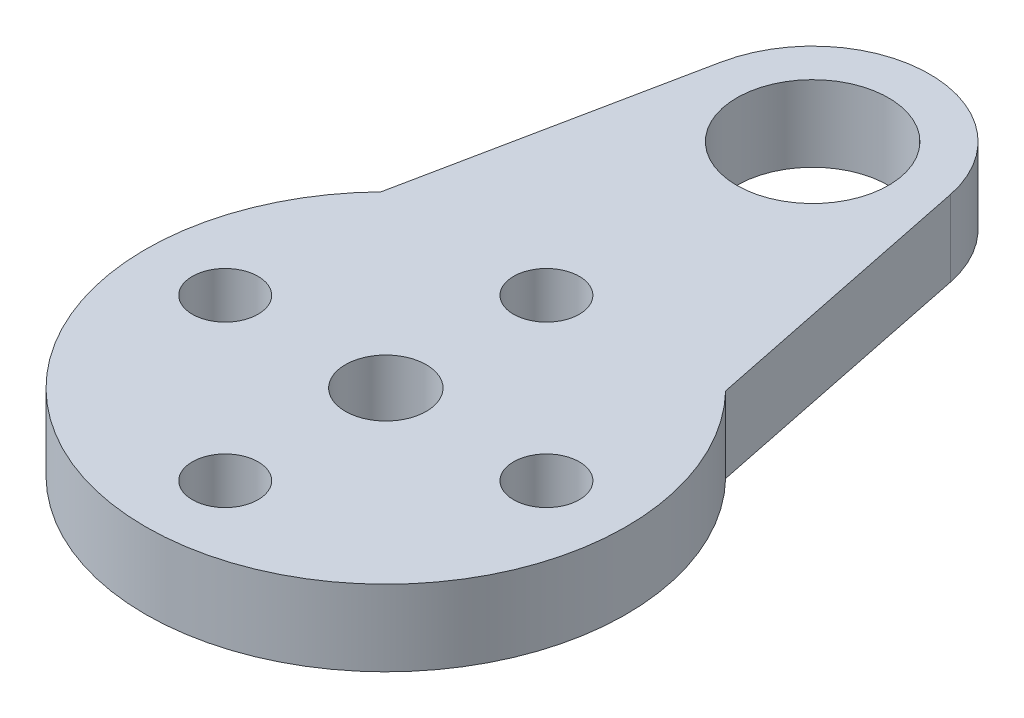
ISO-10303-21;
HEADER;
FILE_DESCRIPTION(('STEP AP214'),'2;1');
FILE_NAME('part.step','',(''),(''),'','','');
FILE_SCHEMA(('AUTOMOTIVE_DESIGN { 1 0 10303 214 1 1 1 1 }'));
ENDSEC;
DATA;
#1=APPLICATION_CONTEXT('core data for automotive mechanical design processes');
#2=APPLICATION_PROTOCOL_DEFINITION('international standard','automotive_design',2000,#1);
#3=PRODUCT_CONTEXT('',#1,'mechanical');
#4=PRODUCT('Part','Part','',(#3));
#5=PRODUCT_RELATED_PRODUCT_CATEGORY('part','',(#4));
#6=PRODUCT_DEFINITION_FORMATION('','',#4);
#7=PRODUCT_DEFINITION_CONTEXT('part definition',#1,'design');
#8=PRODUCT_DEFINITION('design','',#6,#7);
#9=PRODUCT_DEFINITION_SHAPE('','',#8);
#10=(LENGTH_UNIT() NAMED_UNIT(*) SI_UNIT(.MILLI.,.METRE.));
#11=(NAMED_UNIT(*) PLANE_ANGLE_UNIT() SI_UNIT($,.RADIAN.));
#12=(NAMED_UNIT(*) SI_UNIT($,.STERADIAN.) SOLID_ANGLE_UNIT());
#13=UNCERTAINTY_MEASURE_WITH_UNIT(LENGTH_MEASURE(1.E-05),#10,'distance_accuracy_value','');
#14=(GEOMETRIC_REPRESENTATION_CONTEXT(3) GLOBAL_UNCERTAINTY_ASSIGNED_CONTEXT((#13)) GLOBAL_UNIT_ASSIGNED_CONTEXT((#10,
#11,#12)) REPRESENTATION_CONTEXT('',''));
#15=CARTESIAN_POINT('',(0.,0.,0.));
#16=DIRECTION('',(0.,0.,1.));
#17=DIRECTION('',(1.,0.,0.));
#18=AXIS2_PLACEMENT_3D('',#15,#16,#17);
#19=CARTESIAN_POINT('',(0.,3.,-16.87456));
#20=DIRECTION('',(0.,1.,0.));
#21=DIRECTION('',(0.,0.,1.));
#22=AXIS2_PLACEMENT_3D('',#19,#20,#21);
#23=PLANE('',#22);
#24=DIRECTION('',(-0.2,0.,0.979795897113271));
#25=VECTOR('',#24,1.);
#26=CARTESIAN_POINT('',(-4.53164224618782,3.,-17.7995776));
#27=LINE('',#26,#25);
#28=CARTESIAN_POINT('',(-4.53164224618782,3.,-17.7995776));
#29=VERTEX_POINT('',#28);
#30=CARTESIAN_POINT('',(-6.81367210031021,3.,-6.61996015920445));
#31=VERTEX_POINT('',#30);
#32=EDGE_CURVE('E94',#29,#31,#27,.T.);
#33=ORIENTED_EDGE('',*,*,#32,.T.);
#34=CARTESIAN_POINT('',(0.,3.,0.));
#35=DIRECTION('',(0.,1.,0.));
#36=DIRECTION('',(0.,0.,1.));
#37=AXIS2_PLACEMENT_3D('',#34,#35,#36);
#38=CIRCLE('',#37,9.5);
#39=CARTESIAN_POINT('',(6.81367210031021,3.,-6.61996015920446));
#40=VERTEX_POINT('',#39);
#41=EDGE_CURVE('E48',#31,#40,#38,.T.);
#42=ORIENTED_EDGE('',*,*,#41,.T.);
#43=DIRECTION('',(-0.2,0.,-0.979795897113271));
#44=VECTOR('',#43,1.);
#45=CARTESIAN_POINT('',(4.53164224618782,3.,-17.7995776));
#46=LINE('',#45,#44);
#47=CARTESIAN_POINT('',(4.53164224618782,3.,-17.7995776));
#48=VERTEX_POINT('',#47);
#49=EDGE_CURVE('E54',#40,#48,#46,.T.);
#50=ORIENTED_EDGE('',*,*,#49,.T.);
#51=CARTESIAN_POINT('',(0.,3.,-16.87456));
#52=DIRECTION('',(0.,1.,0.));
#53=DIRECTION('',(0.,0.,1.));
#54=AXIS2_PLACEMENT_3D('',#51,#52,#53);
#55=CIRCLE('',#54,4.625088);
#56=EDGE_CURVE('E76',#48,#29,#55,.T.);
#57=ORIENTED_EDGE('',*,*,#56,.T.);
#58=EDGE_LOOP('',(#33,#42,#50,#57));
#59=FACE_BOUND('',#58,.T.);
#60=CARTESIAN_POINT('',(0.,3.,-6.35));
#61=DIRECTION('',(0.,1.,0.));
#62=DIRECTION('',(0.,0.,1.));
#63=AXIS2_PLACEMENT_3D('',#60,#61,#62);
#64=CIRCLE('',#63,1.3);
#65=CARTESIAN_POINT('',(0.,3.,-5.05));
#66=VERTEX_POINT('',#65);
#67=EDGE_CURVE('E124',#66,#66,#64,.T.);
#68=ORIENTED_EDGE('',*,*,#67,.F.);
#69=EDGE_LOOP('',(#68));
#70=FACE_BOUND('',#69,.T.);
#71=CARTESIAN_POINT('',(6.35000000000018,3.,-1.79311378806878E-13));
#72=DIRECTION('',(0.,1.,0.));
#73=DIRECTION('',(0.,0.,1.));
#74=AXIS2_PLACEMENT_3D('',#71,#72,#73);
#75=CIRCLE('',#74,1.30000000000014);
#76=CARTESIAN_POINT('',(6.35000000000018,3.,1.29999999999996));
#77=VERTEX_POINT('',#76);
#78=EDGE_CURVE('E118',#77,#77,#75,.T.);
#79=ORIENTED_EDGE('',*,*,#78,.F.);
#80=EDGE_LOOP('',(#79));
#81=FACE_BOUND('',#80,.T.);
#82=CARTESIAN_POINT('',(3.58622757613755E-13,3.,6.35));
#83=DIRECTION('',(0.,1.,0.));
#84=DIRECTION('',(0.,0.,1.));
#85=AXIS2_PLACEMENT_3D('',#82,#83,#84);
#86=CIRCLE('',#85,1.30000000000039);
#87=CARTESIAN_POINT('',(3.58622757613755E-13,3.,7.65000000000039));
#88=VERTEX_POINT('',#87);
#89=EDGE_CURVE('E112',#88,#88,#86,.T.);
#90=ORIENTED_EDGE('',*,*,#89,.F.);
#91=EDGE_LOOP('',(#90));
#92=FACE_BOUND('',#91,.T.);
#93=CARTESIAN_POINT('',(-6.34999999999982,3.,1.80089029524336E-13));
#94=DIRECTION('',(0.,1.,0.));
#95=DIRECTION('',(0.,0.,1.));
#96=AXIS2_PLACEMENT_3D('',#93,#94,#95);
#97=CIRCLE('',#96,1.30000000000029);
#98=CARTESIAN_POINT('',(-6.34999999999982,3.,1.30000000000047));
#99=VERTEX_POINT('',#98);
#100=EDGE_CURVE('E106',#99,#99,#97,.T.);
#101=ORIENTED_EDGE('',*,*,#100,.F.);
#102=EDGE_LOOP('',(#101));
#103=FACE_BOUND('',#102,.T.);
#104=CARTESIAN_POINT('',(0.,3.,-16.87456));
#105=DIRECTION('',(0.,1.,0.));
#106=DIRECTION('',(0.,0.,1.));
#107=AXIS2_PLACEMENT_3D('',#104,#105,#106);
#108=CIRCLE('',#107,3.);
#109=CARTESIAN_POINT('',(0.,3.,-13.87456));
#110=VERTEX_POINT('',#109);
#111=EDGE_CURVE('E86',#110,#110,#108,.T.);
#112=ORIENTED_EDGE('',*,*,#111,.F.);
#113=EDGE_LOOP('',(#112));
#114=FACE_BOUND('',#113,.T.);
#115=CARTESIAN_POINT('',(0.,3.,0.));
#116=DIRECTION('',(0.,1.,0.));
#117=DIRECTION('',(0.,0.,1.));
#118=AXIS2_PLACEMENT_3D('',#115,#116,#117);
#119=CIRCLE('',#118,1.6);
#120=CARTESIAN_POINT('',(0.,3.,1.6));
#121=VERTEX_POINT('',#120);
#122=EDGE_CURVE('E98',#121,#121,#119,.T.);
#123=ORIENTED_EDGE('',*,*,#122,.F.);
#124=EDGE_LOOP('',(#123));
#125=FACE_BOUND('',#124,.T.);
#126=ADVANCED_FACE('F33',(#59,#70,#81,#92,#103,#114,#125),#23,.T.);
#127=CARTESIAN_POINT('',(0.,0.,-16.87456));
#128=DIRECTION('',(0.,1.,0.));
#129=DIRECTION('',(0.,0.,1.));
#130=AXIS2_PLACEMENT_3D('',#127,#128,#129);
#131=PLANE('',#130);
#132=CARTESIAN_POINT('',(0.,0.,0.));
#133=DIRECTION('',(0.,1.,0.));
#134=DIRECTION('',(0.,0.,1.));
#135=AXIS2_PLACEMENT_3D('',#132,#133,#134);
#136=CIRCLE('',#135,9.5);
#137=CARTESIAN_POINT('',(-6.81367210031021,0.,-6.61996015920445));
#138=VERTEX_POINT('',#137);
#139=CARTESIAN_POINT('',(6.8136721003102,0.,-6.61996015920446));
#140=VERTEX_POINT('',#139);
#141=EDGE_CURVE('E132',#138,#140,#136,.T.);
#142=ORIENTED_EDGE('',*,*,#141,.F.);
#143=DIRECTION('',(-0.2,0.,0.979795897113271));
#144=VECTOR('',#143,1.);
#145=CARTESIAN_POINT('',(-4.53164224618782,0.,-17.7995776));
#146=LINE('',#145,#144);
#147=CARTESIAN_POINT('',(-4.53164224618782,0.,-17.7995776));
#148=VERTEX_POINT('',#147);
#149=EDGE_CURVE('E77',#148,#138,#146,.T.);
#150=ORIENTED_EDGE('',*,*,#149,.F.);
#151=CARTESIAN_POINT('',(0.,0.,-16.87456));
#152=DIRECTION('',(0.,1.,0.));
#153=DIRECTION('',(0.,0.,1.));
#154=AXIS2_PLACEMENT_3D('',#151,#152,#153);
#155=CIRCLE('',#154,4.625088);
#156=CARTESIAN_POINT('',(4.53164224618782,0.,-17.7995776));
#157=VERTEX_POINT('',#156);
#158=EDGE_CURVE('E82',#157,#148,#155,.T.);
#159=ORIENTED_EDGE('',*,*,#158,.F.);
#160=DIRECTION('',(-0.2,0.,-0.979795897113271));
#161=VECTOR('',#160,1.);
#162=CARTESIAN_POINT('',(4.53164224618782,0.,-17.7995776));
#163=LINE('',#162,#161);
#164=EDGE_CURVE('E68',#140,#157,#163,.T.);
#165=ORIENTED_EDGE('',*,*,#164,.F.);
#166=EDGE_LOOP('',(#142,#150,#159,#165));
#167=FACE_BOUND('',#166,.T.);
#168=CARTESIAN_POINT('',(0.,0.,-6.35));
#169=DIRECTION('',(0.,1.,0.));
#170=DIRECTION('',(0.,0.,1.));
#171=AXIS2_PLACEMENT_3D('',#168,#169,#170);
#172=CIRCLE('',#171,1.3);
#173=CARTESIAN_POINT('',(0.,0.,-5.05));
#174=VERTEX_POINT('',#173);
#175=EDGE_CURVE('E103',#174,#174,#172,.T.);
#176=ORIENTED_EDGE('',*,*,#175,.T.);
#177=EDGE_LOOP('',(#176));
#178=FACE_BOUND('',#177,.T.);
#179=CARTESIAN_POINT('',(6.35000000000018,0.,-1.79311378806878E-13));
#180=DIRECTION('',(0.,1.,0.));
#181=DIRECTION('',(0.,0.,1.));
#182=AXIS2_PLACEMENT_3D('',#179,#180,#181);
#183=CIRCLE('',#182,1.30000000000014);
#184=CARTESIAN_POINT('',(6.35000000000018,0.,1.29999999999996));
#185=VERTEX_POINT('',#184);
#186=EDGE_CURVE('E121',#185,#185,#183,.T.);
#187=ORIENTED_EDGE('',*,*,#186,.T.);
#188=EDGE_LOOP('',(#187));
#189=FACE_BOUND('',#188,.T.);
#190=CARTESIAN_POINT('',(3.58622757613755E-13,0.,6.35));
#191=DIRECTION('',(0.,1.,0.));
#192=DIRECTION('',(0.,0.,1.));
#193=AXIS2_PLACEMENT_3D('',#190,#191,#192);
#194=CIRCLE('',#193,1.30000000000039);
#195=CARTESIAN_POINT('',(3.58622757613755E-13,0.,7.65000000000039));
#196=VERTEX_POINT('',#195);
#197=EDGE_CURVE('E115',#196,#196,#194,.T.);
#198=ORIENTED_EDGE('',*,*,#197,.T.);
#199=EDGE_LOOP('',(#198));
#200=FACE_BOUND('',#199,.T.);
#201=CARTESIAN_POINT('',(-6.34999999999982,0.,1.80089029524336E-13));
#202=DIRECTION('',(0.,1.,0.));
#203=DIRECTION('',(0.,0.,1.));
#204=AXIS2_PLACEMENT_3D('',#201,#202,#203);
#205=CIRCLE('',#204,1.30000000000029);
#206=CARTESIAN_POINT('',(-6.34999999999982,0.,1.30000000000047));
#207=VERTEX_POINT('',#206);
#208=EDGE_CURVE('E109',#207,#207,#205,.T.);
#209=ORIENTED_EDGE('',*,*,#208,.T.);
#210=EDGE_LOOP('',(#209));
#211=FACE_BOUND('',#210,.T.);
#212=CARTESIAN_POINT('',(0.,0.,-16.87456));
#213=DIRECTION('',(0.,1.,0.));
#214=DIRECTION('',(0.,0.,1.));
#215=AXIS2_PLACEMENT_3D('',#212,#213,#214);
#216=CIRCLE('',#215,3.);
#217=CARTESIAN_POINT('',(0.,0.,-13.87456));
#218=VERTEX_POINT('',#217);
#219=EDGE_CURVE('E90',#218,#218,#216,.T.);
#220=ORIENTED_EDGE('',*,*,#219,.T.);
#221=EDGE_LOOP('',(#220));
#222=FACE_BOUND('',#221,.T.);
#223=CARTESIAN_POINT('',(0.,0.,0.));
#224=DIRECTION('',(0.,1.,0.));
#225=DIRECTION('',(0.,0.,1.));
#226=AXIS2_PLACEMENT_3D('',#223,#224,#225);
#227=CIRCLE('',#226,1.6);
#228=CARTESIAN_POINT('',(0.,0.,1.6));
#229=VERTEX_POINT('',#228);
#230=EDGE_CURVE('E100',#229,#229,#227,.T.);
#231=ORIENTED_EDGE('',*,*,#230,.T.);
#232=EDGE_LOOP('',(#231));
#233=FACE_BOUND('',#232,.T.);
#234=ADVANCED_FACE('F83',(#167,#178,#189,#200,#211,#222,#233),#131,.F.);
#235=CARTESIAN_POINT('',(0.,3.,-16.87456));
#236=DIRECTION('',(0.,-1.,0.));
#237=DIRECTION('',(0.,0.,-1.));
#238=AXIS2_PLACEMENT_3D('',#235,#236,#237);
#239=CYLINDRICAL_SURFACE('',#238,4.625088);
#240=ORIENTED_EDGE('',*,*,#158,.T.);
#241=DIRECTION('',(0.,-1.,0.));
#242=VECTOR('',#241,1.);
#243=CARTESIAN_POINT('',(-4.53164224618782,3.,-17.7995776));
#244=LINE('',#243,#242);
#245=EDGE_CURVE('E11',#29,#148,#244,.T.);
#246=ORIENTED_EDGE('',*,*,#245,.F.);
#247=ORIENTED_EDGE('',*,*,#56,.F.);
#248=DIRECTION('',(0.,-1.,0.));
#249=VECTOR('',#248,1.);
#250=CARTESIAN_POINT('',(4.53164224618782,3.,-17.7995776));
#251=LINE('',#250,#249);
#252=EDGE_CURVE('E41',#48,#157,#251,.T.);
#253=ORIENTED_EDGE('',*,*,#252,.T.);
#254=EDGE_LOOP('',(#240,#246,#247,#253));
#255=FACE_BOUND('',#254,.T.);
#256=ADVANCED_FACE('F35',(#255),#239,.T.);
#257=CARTESIAN_POINT('',(-4.53164224618782,3.,-17.7995776));
#258=DIRECTION('',(0.979795897113271,0.,0.2));
#259=DIRECTION('',(0.2,0.,-0.979795897113271));
#260=AXIS2_PLACEMENT_3D('',#257,#258,#259);
#261=PLANE('',#260);
#262=ORIENTED_EDGE('',*,*,#149,.T.);
#263=DIRECTION('',(0.,1.,0.));
#264=VECTOR('',#263,1.);
#265=CARTESIAN_POINT('',(-6.81367210031021,0.,-6.61996015920445));
#266=LINE('',#265,#264);
#267=EDGE_CURVE('E129',#138,#31,#266,.T.);
#268=ORIENTED_EDGE('',*,*,#267,.T.);
#269=ORIENTED_EDGE('',*,*,#32,.F.);
#270=ORIENTED_EDGE('',*,*,#245,.T.);
#271=EDGE_LOOP('',(#262,#268,#269,#270));
#272=FACE_BOUND('',#271,.T.);
#273=ADVANCED_FACE('F144',(#272),#261,.F.);
#274=CARTESIAN_POINT('',(4.53164224618782,3.,-17.7995776));
#275=DIRECTION('',(-0.979795897113271,0.,0.2));
#276=DIRECTION('',(0.2,0.,0.979795897113271));
#277=AXIS2_PLACEMENT_3D('',#274,#275,#276);
#278=PLANE('',#277);
#279=ORIENTED_EDGE('',*,*,#49,.F.);
#280=DIRECTION('',(0.,1.,0.));
#281=VECTOR('',#280,1.);
#282=CARTESIAN_POINT('',(6.8136721003102,0.,-6.61996015920446));
#283=LINE('',#282,#281);
#284=EDGE_CURVE('E72',#140,#40,#283,.T.);
#285=ORIENTED_EDGE('',*,*,#284,.F.);
#286=ORIENTED_EDGE('',*,*,#164,.T.);
#287=ORIENTED_EDGE('',*,*,#252,.F.);
#288=EDGE_LOOP('',(#279,#285,#286,#287));
#289=FACE_BOUND('',#288,.T.);
#290=ADVANCED_FACE('F70',(#289),#278,.F.);
#291=CARTESIAN_POINT('',(0.,3.,-16.87456));
#292=DIRECTION('',(0.,-1.,0.));
#293=DIRECTION('',(0.,0.,-1.));
#294=AXIS2_PLACEMENT_3D('',#291,#292,#293);
#295=CYLINDRICAL_SURFACE('',#294,3.);
#296=ORIENTED_EDGE('',*,*,#111,.T.);
#297=EDGE_LOOP('',(#296));
#298=FACE_BOUND('',#297,.T.);
#299=ORIENTED_EDGE('',*,*,#219,.F.);
#300=EDGE_LOOP('',(#299));
#301=FACE_BOUND('',#300,.T.);
#302=ADVANCED_FACE('F164',(#298,#301),#295,.F.);
#303=CARTESIAN_POINT('',(0.,3.,0.));
#304=DIRECTION('',(0.,-1.,0.));
#305=DIRECTION('',(0.,0.,-1.));
#306=AXIS2_PLACEMENT_3D('',#303,#304,#305);
#307=CYLINDRICAL_SURFACE('',#306,1.6);
#308=ORIENTED_EDGE('',*,*,#122,.T.);
#309=EDGE_LOOP('',(#308));
#310=FACE_BOUND('',#309,.T.);
#311=ORIENTED_EDGE('',*,*,#230,.F.);
#312=EDGE_LOOP('',(#311));
#313=FACE_BOUND('',#312,.T.);
#314=ADVANCED_FACE('F160',(#310,#313),#307,.F.);
#315=CARTESIAN_POINT('',(-6.34999999999982,0.,1.80089029524336E-13));
#316=DIRECTION('',(0.,1.,0.));
#317=DIRECTION('',(0.,0.,1.));
#318=AXIS2_PLACEMENT_3D('',#315,#316,#317);
#319=CYLINDRICAL_SURFACE('',#318,1.30000000000029);
#320=ORIENTED_EDGE('',*,*,#208,.F.);
#321=EDGE_LOOP('',(#320));
#322=FACE_BOUND('',#321,.T.);
#323=ORIENTED_EDGE('',*,*,#100,.T.);
#324=EDGE_LOOP('',(#323));
#325=FACE_BOUND('',#324,.T.);
#326=ADVANCED_FACE('F163',(#322,#325),#319,.F.);
#327=CARTESIAN_POINT('',(3.58622757613755E-13,0.,6.35));
#328=DIRECTION('',(0.,1.,0.));
#329=DIRECTION('',(0.,0.,1.));
#330=AXIS2_PLACEMENT_3D('',#327,#328,#329);
#331=CYLINDRICAL_SURFACE('',#330,1.30000000000039);
#332=ORIENTED_EDGE('',*,*,#197,.F.);
#333=EDGE_LOOP('',(#332));
#334=FACE_BOUND('',#333,.T.);
#335=ORIENTED_EDGE('',*,*,#89,.T.);
#336=EDGE_LOOP('',(#335));
#337=FACE_BOUND('',#336,.T.);
#338=ADVANCED_FACE('F202',(#334,#337),#331,.F.);
#339=CARTESIAN_POINT('',(6.35000000000018,0.,-1.79311378806878E-13));
#340=DIRECTION('',(0.,1.,0.));
#341=DIRECTION('',(0.,0.,1.));
#342=AXIS2_PLACEMENT_3D('',#339,#340,#341);
#343=CYLINDRICAL_SURFACE('',#342,1.30000000000014);
#344=ORIENTED_EDGE('',*,*,#186,.F.);
#345=EDGE_LOOP('',(#344));
#346=FACE_BOUND('',#345,.T.);
#347=ORIENTED_EDGE('',*,*,#78,.T.);
#348=EDGE_LOOP('',(#347));
#349=FACE_BOUND('',#348,.T.);
#350=ADVANCED_FACE('F210',(#346,#349),#343,.F.);
#351=CARTESIAN_POINT('',(0.,0.,-6.35));
#352=DIRECTION('',(0.,1.,0.));
#353=DIRECTION('',(0.,0.,1.));
#354=AXIS2_PLACEMENT_3D('',#351,#352,#353);
#355=CYLINDRICAL_SURFACE('',#354,1.3);
#356=ORIENTED_EDGE('',*,*,#175,.F.);
#357=EDGE_LOOP('',(#356));
#358=FACE_BOUND('',#357,.T.);
#359=ORIENTED_EDGE('',*,*,#67,.T.);
#360=EDGE_LOOP('',(#359));
#361=FACE_BOUND('',#360,.T.);
#362=ADVANCED_FACE('F218',(#358,#361),#355,.F.);
#363=CARTESIAN_POINT('',(0.,0.,0.));
#364=DIRECTION('',(0.,1.,0.));
#365=DIRECTION('',(0.,0.,1.));
#366=AXIS2_PLACEMENT_3D('',#363,#364,#365);
#367=CYLINDRICAL_SURFACE('',#366,9.5);
#368=ORIENTED_EDGE('',*,*,#41,.F.);
#369=ORIENTED_EDGE('',*,*,#267,.F.);
#370=ORIENTED_EDGE('',*,*,#141,.T.);
#371=ORIENTED_EDGE('',*,*,#284,.T.);
#372=EDGE_LOOP('',(#368,#369,#370,#371));
#373=FACE_BOUND('',#372,.T.);
#374=ADVANCED_FACE('F138',(#373),#367,.T.);
#375=CLOSED_SHELL('',(#126,#234,#256,#273,#290,#302,#314,#326,#338,#350,#362,#374));
#376=MANIFOLD_SOLID_BREP('B2',#375);
#377=ADVANCED_BREP_SHAPE_REPRESENTATION('',(#18,#376),#14);
#378=SHAPE_DEFINITION_REPRESENTATION(#9,#377);
ENDSEC;
END-ISO-10303-21;
